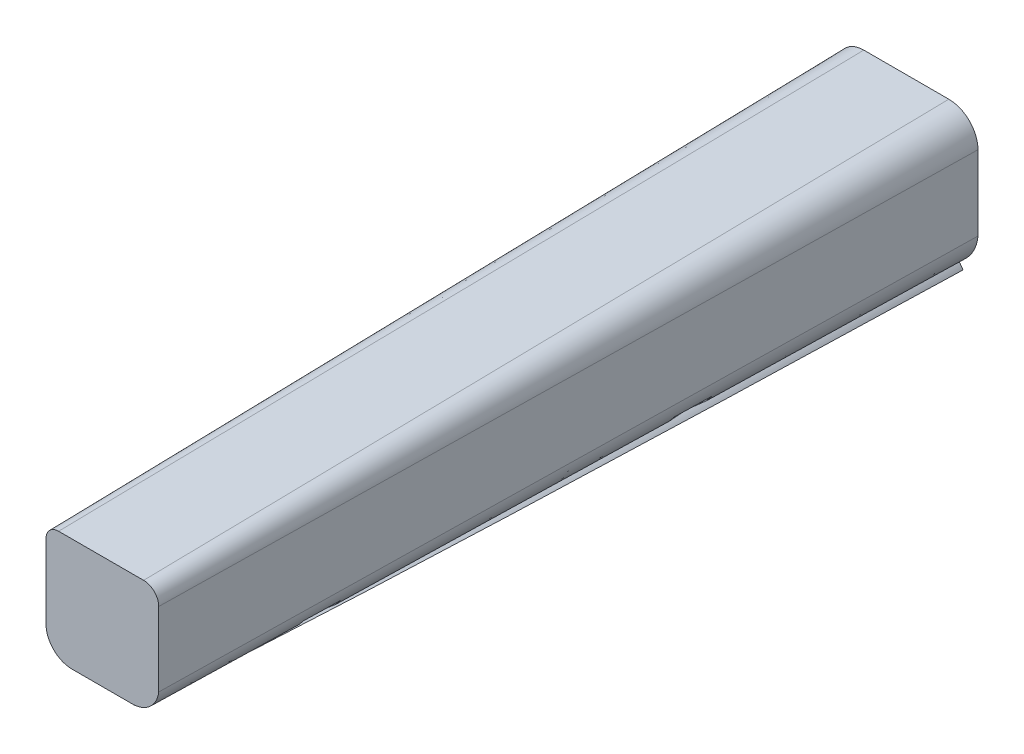
ISO-10303-21;
HEADER;
FILE_DESCRIPTION(('STEP AP214'),'2;1');
FILE_NAME('part.step','',(''),(''),'','','');
FILE_SCHEMA(('AUTOMOTIVE_DESIGN { 1 0 10303 214 1 1 1 1 }'));
ENDSEC;
DATA;
#1=APPLICATION_CONTEXT('core data for automotive mechanical design processes');
#2=APPLICATION_PROTOCOL_DEFINITION('international standard','automotive_design',2000,#1);
#3=PRODUCT_CONTEXT('',#1,'mechanical');
#4=PRODUCT('Part','Part','',(#3));
#5=PRODUCT_RELATED_PRODUCT_CATEGORY('part','',(#4));
#6=PRODUCT_DEFINITION_FORMATION('','',#4);
#7=PRODUCT_DEFINITION_CONTEXT('part definition',#1,'design');
#8=PRODUCT_DEFINITION('design','',#6,#7);
#9=PRODUCT_DEFINITION_SHAPE('','',#8);
#10=(LENGTH_UNIT() NAMED_UNIT(*) SI_UNIT(.MILLI.,.METRE.));
#11=(NAMED_UNIT(*) PLANE_ANGLE_UNIT() SI_UNIT($,.RADIAN.));
#12=(NAMED_UNIT(*) SI_UNIT($,.STERADIAN.) SOLID_ANGLE_UNIT());
#13=UNCERTAINTY_MEASURE_WITH_UNIT(LENGTH_MEASURE(1.E-05),#10,'distance_accuracy_value','');
#14=(GEOMETRIC_REPRESENTATION_CONTEXT(3) GLOBAL_UNCERTAINTY_ASSIGNED_CONTEXT((#13)) GLOBAL_UNIT_ASSIGNED_CONTEXT((#10,
#11,#12)) REPRESENTATION_CONTEXT('',''));
#15=CARTESIAN_POINT('',(0.,0.,0.));
#16=DIRECTION('',(0.,0.,1.));
#17=DIRECTION('',(1.,0.,0.));
#18=AXIS2_PLACEMENT_3D('',#15,#16,#17);
#19=CARTESIAN_POINT('',(-35.,35.,500.));
#20=DIRECTION('',(-0.999847695156391,0.,0.0174524064372835));
#21=DIRECTION('',(0.0174524064372835,0.,0.999847695156391));
#22=AXIS2_PLACEMENT_3D('',#19,#20,#21);
#23=PLANE('',#22);
#24=DIRECTION('',(-0.0174524064372835,0.,-0.999847695156391));
#25=VECTOR('',#24,1.);
#26=CARTESIAN_POINT('',(-35.,-18.8530894982488,500.));
#27=LINE('',#26,#25);
#28=CARTESIAN_POINT('',(-43.7275324641088,-18.8530894982488,0.));
#29=VERTEX_POINT('',#28);
#30=CARTESIAN_POINT('',(-35.,-18.8530894982488,500.));
#31=VERTEX_POINT('',#30);
#32=EDGE_CURVE('E145',#29,#31,#27,.F.);
#33=ORIENTED_EDGE('',*,*,#32,.T.);
#34=DIRECTION('',(0.,-1.,0.));
#35=VECTOR('',#34,1.);
#36=CARTESIAN_POINT('',(-35.,35.,500.));
#37=LINE('',#36,#35);
#38=CARTESIAN_POINT('',(-35.,27.1753626111588,500.));
#39=VERTEX_POINT('',#38);
#40=EDGE_CURVE('E120',#39,#31,#37,.T.);
#41=ORIENTED_EDGE('',*,*,#40,.F.);
#42=DIRECTION('',(-0.0174524064372835,0.,-0.999847695156391));
#43=VECTOR('',#42,1.);
#44=CARTESIAN_POINT('',(-35.,27.1753626111588,500.));
#45=LINE('',#44,#43);
#46=CARTESIAN_POINT('',(-43.7275324641088,27.1753626111588,0.));
#47=VERTEX_POINT('',#46);
#48=EDGE_CURVE('E104',#47,#39,#45,.F.);
#49=ORIENTED_EDGE('',*,*,#48,.F.);
#50=DIRECTION('',(0.,1.,0.));
#51=VECTOR('',#50,1.);
#52=CARTESIAN_POINT('',(-43.7275324641088,35.,0.));
#53=LINE('',#52,#51);
#54=EDGE_CURVE('E188',#47,#29,#53,.F.);
#55=ORIENTED_EDGE('',*,*,#54,.T.);
#56=EDGE_LOOP('',(#33,#41,#49,#55));
#57=FACE_BOUND('',#56,.T.);
#58=ADVANCED_FACE('F33',(#57),#23,.T.);
#59=CARTESIAN_POINT('',(35.,35.,500.));
#60=DIRECTION('',(0.999847695156391,0.,0.0174524064372835));
#61=DIRECTION('',(0.0174524064372835,0.,-0.999847695156391));
#62=AXIS2_PLACEMENT_3D('',#59,#60,#61);
#63=PLANE('',#62);
#64=DIRECTION('',(0.0174524064372835,0.,-0.999847695156391));
#65=VECTOR('',#64,1.);
#66=CARTESIAN_POINT('',(35.,25.617969734714,500.));
#67=LINE('',#66,#65);
#68=CARTESIAN_POINT('',(43.7275324641088,25.617969734714,0.));
#69=VERTEX_POINT('',#68);
#70=CARTESIAN_POINT('',(35.,25.617969734714,500.));
#71=VERTEX_POINT('',#70);
#72=EDGE_CURVE('E37',#69,#71,#67,.F.);
#73=ORIENTED_EDGE('',*,*,#72,.T.);
#74=DIRECTION('',(0.,1.,0.));
#75=VECTOR('',#74,1.);
#76=CARTESIAN_POINT('',(35.,35.,500.));
#77=LINE('',#76,#75);
#78=CARTESIAN_POINT('',(35.,-20.3554174348118,500.));
#79=VERTEX_POINT('',#78);
#80=EDGE_CURVE('E121',#79,#71,#77,.T.);
#81=ORIENTED_EDGE('',*,*,#80,.F.);
#82=CARTESIAN_POINT('',(43.7275324641088,-20.8024766961162,0.));
#83=CARTESIAN_POINT('',(43.4386732457331,-20.7890932360126,16.5487335374341));
#84=CARTESIAN_POINT('',(43.1498140288684,-20.775599016947,33.0974669883076));
#85=CARTESIAN_POINT('',(41.7055179524502,-20.707530118496,115.841133789759));
#86=CARTESIAN_POINT('',(40.5500811182559,-20.6511620298168,182.036065687517));
#87=CARTESIAN_POINT('',(37.9297628119664,-20.5177138251656,332.154000915221));
#88=CARTESIAN_POINT('',(36.4648813632845,-20.4391297232407,416.077002903819));
#89=CARTESIAN_POINT('',(35.,-20.3554174348118,500.));
#90=B_SPLINE_CURVE_WITH_KNOTS('',3,(#82,#83,#84,#85,#86,#87,#88,#89),.UNSPECIFIED.,.F.,.F.,(4,2,
2,4),(0.,49.6537793608185,248.268896898181,500.076364439177),.UNSPECIFIED.);
#91=CARTESIAN_POINT('',(43.7275324641088,-20.8024766961162,0.));
#92=VERTEX_POINT('',#91);
#93=EDGE_CURVE('E159',#92,#79,#90,.T.);
#94=ORIENTED_EDGE('',*,*,#93,.F.);
#95=DIRECTION('',(0.,-1.,0.));
#96=VECTOR('',#95,1.);
#97=CARTESIAN_POINT('',(43.7275324641088,35.,0.));
#98=LINE('',#97,#96);
#99=EDGE_CURVE('E132',#92,#69,#98,.F.);
#100=ORIENTED_EDGE('',*,*,#99,.T.);
#101=EDGE_LOOP('',(#73,#81,#94,#100));
#102=FACE_BOUND('',#101,.T.);
#103=ADVANCED_FACE('F170',(#102),#63,.T.);
#104=CARTESIAN_POINT('',(0.,0.,500.));
#105=DIRECTION('',(0.,0.,1.));
#106=DIRECTION('',(1.,0.,0.));
#107=AXIS2_PLACEMENT_3D('',#104,#105,#106);
#108=PLANE('',#107);
#109=CARTESIAN_POINT('',(19.586164264741,-51.8768525911298,500.));
#110=DIRECTION('',(0.,0.,1.));
#111=DIRECTION('',(1.,0.,0.));
#112=AXIS2_PLACEMENT_3D('',#109,#110,#111);
#113=CIRCLE('',#112,16.9070860603069);
#114=CARTESIAN_POINT('',(19.5748374743707,-34.9697703249774,500.));
#115=VERTEX_POINT('',#114);
#116=CARTESIAN_POINT('',(20.596810428292,-35.,500.));
#117=VERTEX_POINT('',#116);
#118=EDGE_CURVE('E52',#115,#117,#113,.F.);
#119=ORIENTED_EDGE('',*,*,#118,.F.);
#120=CARTESIAN_POINT('',(18.5755181011902,-18.4673538150547,500.));
#121=DIRECTION('',(0.,0.,1.));
#122=DIRECTION('',(1.,0.,0.));
#123=AXIS2_PLACEMENT_3D('',#120,#121,#122);
#124=CIRCLE('',#123,16.5326461849452);
#125=EDGE_CURVE('E205',#115,#79,#124,.T.);
#126=ORIENTED_EDGE('',*,*,#125,.T.);
#127=ORIENTED_EDGE('',*,*,#80,.T.);
#128=CARTESIAN_POINT('',(25.617969734714,25.617969734714,500.));
#129=DIRECTION('',(0.,0.,-1.));
#130=DIRECTION('',(1.,0.,0.));
#131=AXIS2_PLACEMENT_3D('',#128,#129,#130);
#132=CIRCLE('',#131,9.38203026528603);
#133=CARTESIAN_POINT('',(25.617969734714,35.,500.));
#134=VERTEX_POINT('',#133);
#135=EDGE_CURVE('E116',#134,#71,#132,.T.);
#136=ORIENTED_EDGE('',*,*,#135,.F.);
#137=DIRECTION('',(-1.,0.,0.));
#138=VECTOR('',#137,1.);
#139=CARTESIAN_POINT('',(-35.,35.,500.));
#140=LINE('',#139,#138);
#141=CARTESIAN_POINT('',(-27.1753626111588,35.,500.));
#142=VERTEX_POINT('',#141);
#143=EDGE_CURVE('E110',#134,#142,#140,.T.);
#144=ORIENTED_EDGE('',*,*,#143,.T.);
#145=CARTESIAN_POINT('',(-27.1753626111588,27.1753626111588,500.));
#146=DIRECTION('',(0.,0.,-1.));
#147=DIRECTION('',(1.,0.,0.));
#148=AXIS2_PLACEMENT_3D('',#145,#146,#147);
#149=CIRCLE('',#148,7.82463738884118);
#150=EDGE_CURVE('E113',#39,#142,#149,.T.);
#151=ORIENTED_EDGE('',*,*,#150,.F.);
#152=ORIENTED_EDGE('',*,*,#40,.T.);
#153=CARTESIAN_POINT('',(-18.8530894982488,-18.8530894982488,500.));
#154=DIRECTION('',(0.,0.,-1.));
#155=DIRECTION('',(1.,0.,0.));
#156=AXIS2_PLACEMENT_3D('',#153,#154,#155);
#157=CIRCLE('',#156,16.1469105017512);
#158=CARTESIAN_POINT('',(-18.8530894982488,-35.,500.));
#159=VERTEX_POINT('',#158);
#160=EDGE_CURVE('E183',#159,#31,#157,.T.);
#161=ORIENTED_EDGE('',*,*,#160,.F.);
#162=DIRECTION('',(1.,0.,0.));
#163=VECTOR('',#162,1.);
#164=CARTESIAN_POINT('',(-35.,-35.,500.));
#165=LINE('',#164,#163);
#166=EDGE_CURVE('E43',#159,#117,#165,.T.);
#167=ORIENTED_EDGE('',*,*,#166,.T.);
#168=EDGE_LOOP('',(#119,#126,#127,#136,#144,#151,#152,#161,#167));
#169=FACE_BOUND('',#168,.T.);
#170=ADVANCED_FACE('F111',(#169),#108,.T.);
#171=CARTESIAN_POINT('',(0.,0.,0.));
#172=DIRECTION('',(0.,0.,1.));
#173=DIRECTION('',(1.,0.,0.));
#174=AXIS2_PLACEMENT_3D('',#171,#172,#173);
#175=PLANE('',#174);
#176=CARTESIAN_POINT('',(18.5755181011902,-18.4673538150547,0.));
#177=DIRECTION('',(0.,0.,1.));
#178=DIRECTION('',(1.,0.,0.));
#179=AXIS2_PLACEMENT_3D('',#176,#177,#178);
#180=CIRCLE('',#179,25.260178649054);
#181=CARTESIAN_POINT('',(31.6802371063288,-40.062329276455,0.));
#182=VERTEX_POINT('',#181);
#183=EDGE_CURVE('E150',#182,#92,#180,.T.);
#184=ORIENTED_EDGE('',*,*,#183,.F.);
#185=CARTESIAN_POINT('',(19.586164264741,-51.8768525911298,0.));
#186=DIRECTION('',(0.,0.,1.));
#187=DIRECTION('',(1.,0.,0.));
#188=AXIS2_PLACEMENT_3D('',#185,#186,#187);
#189=CIRCLE('',#188,16.9070860603069);
#190=CARTESIAN_POINT('',(34.3996088512629,-43.7275324641088,0.));
#191=VERTEX_POINT('',#190);
#192=EDGE_CURVE('E152',#182,#191,#189,.F.);
#193=ORIENTED_EDGE('',*,*,#192,.T.);
#194=DIRECTION('',(-1.,0.,0.));
#195=VECTOR('',#194,1.);
#196=CARTESIAN_POINT('',(-35.,-43.7275324641088,0.));
#197=LINE('',#196,#195);
#198=CARTESIAN_POINT('',(-18.8530894982488,-43.7275324641088,0.));
#199=VERTEX_POINT('',#198);
#200=EDGE_CURVE('E185',#199,#191,#197,.F.);
#201=ORIENTED_EDGE('',*,*,#200,.F.);
#202=CARTESIAN_POINT('',(-18.8530894982488,-18.8530894982488,0.));
#203=DIRECTION('',(0.,0.,1.));
#204=DIRECTION('',(1.,0.,0.));
#205=AXIS2_PLACEMENT_3D('',#202,#203,#204);
#206=CIRCLE('',#205,24.87444296586);
#207=EDGE_CURVE('E189',#199,#29,#206,.F.);
#208=ORIENTED_EDGE('',*,*,#207,.T.);
#209=ORIENTED_EDGE('',*,*,#54,.F.);
#210=CARTESIAN_POINT('',(-27.1753626111588,27.1753626111588,0.));
#211=DIRECTION('',(0.,0.,1.));
#212=DIRECTION('',(1.,0.,0.));
#213=AXIS2_PLACEMENT_3D('',#210,#211,#212);
#214=CIRCLE('',#213,16.55216985295);
#215=CARTESIAN_POINT('',(-27.1753626111588,43.7275324641088,0.));
#216=VERTEX_POINT('',#215);
#217=EDGE_CURVE('E127',#47,#216,#214,.F.);
#218=ORIENTED_EDGE('',*,*,#217,.T.);
#219=DIRECTION('',(1.,0.,0.));
#220=VECTOR('',#219,1.);
#221=CARTESIAN_POINT('',(-35.,43.7275324641088,0.));
#222=LINE('',#221,#220);
#223=CARTESIAN_POINT('',(25.617969734714,43.7275324641088,0.));
#224=VERTEX_POINT('',#223);
#225=EDGE_CURVE('E131',#224,#216,#222,.F.);
#226=ORIENTED_EDGE('',*,*,#225,.F.);
#227=CARTESIAN_POINT('',(25.617969734714,25.617969734714,0.));
#228=DIRECTION('',(0.,0.,1.));
#229=DIRECTION('',(1.,0.,0.));
#230=AXIS2_PLACEMENT_3D('',#227,#228,#229);
#231=CIRCLE('',#230,18.1095627293948);
#232=EDGE_CURVE('E138',#224,#69,#231,.F.);
#233=ORIENTED_EDGE('',*,*,#232,.T.);
#234=ORIENTED_EDGE('',*,*,#99,.F.);
#235=EDGE_LOOP('',(#184,#193,#201,#208,#209,#218,#226,#233,#234));
#236=FACE_BOUND('',#235,.T.);
#237=ADVANCED_FACE('F196',(#236),#175,.F.);
#238=CARTESIAN_POINT('',(-35.,35.,500.));
#239=DIRECTION('',(0.,0.999847695156391,0.0174524064372835));
#240=DIRECTION('',(0.,-0.0174524064372835,0.999847695156391));
#241=AXIS2_PLACEMENT_3D('',#238,#239,#240);
#242=PLANE('',#241);
#243=ORIENTED_EDGE('',*,*,#143,.F.);
#244=DIRECTION('',(0.,0.0174524064372836,-0.999847695156391));
#245=VECTOR('',#244,1.);
#246=CARTESIAN_POINT('',(25.617969734714,35.,500.));
#247=LINE('',#246,#245);
#248=EDGE_CURVE('E137',#224,#134,#247,.F.);
#249=ORIENTED_EDGE('',*,*,#248,.F.);
#250=ORIENTED_EDGE('',*,*,#225,.T.);
#251=DIRECTION('',(0.,0.0174524064372835,-0.999847695156391));
#252=VECTOR('',#251,1.);
#253=CARTESIAN_POINT('',(-27.1753626111588,35.,500.));
#254=LINE('',#253,#252);
#255=EDGE_CURVE('E125',#216,#142,#254,.F.);
#256=ORIENTED_EDGE('',*,*,#255,.T.);
#257=EDGE_LOOP('',(#243,#249,#250,#256));
#258=FACE_BOUND('',#257,.T.);
#259=ADVANCED_FACE('F129',(#258),#242,.T.);
#260=CARTESIAN_POINT('',(-35.,-35.,500.));
#261=DIRECTION('',(0.,-0.999847695156391,0.0174524064372835));
#262=DIRECTION('',(0.,-0.0174524064372835,-0.999847695156391));
#263=AXIS2_PLACEMENT_3D('',#260,#261,#262);
#264=PLANE('',#263);
#265=ORIENTED_EDGE('',*,*,#200,.T.);
#266=CARTESIAN_POINT('',(19.586164264741,-51.8768525911298,-466.874237393806));
#267=DIRECTION('',(0.,-0.999847695156391,0.0174524064372835));
#268=DIRECTION('',(0.,0.0174524064372835,0.999847695156391));
#269=AXIS2_PLACEMENT_3D('',#266,#267,#268);
#270=ELLIPSE('',#269,968.753857587704,16.9070860603069);
#271=EDGE_CURVE('E11',#191,#117,#270,.T.);
#272=ORIENTED_EDGE('',*,*,#271,.T.);
#273=ORIENTED_EDGE('',*,*,#166,.F.);
#274=DIRECTION('',(0.,-0.0174524064372835,-0.999847695156391));
#275=VECTOR('',#274,1.);
#276=CARTESIAN_POINT('',(-18.8530894982488,-35.,500.));
#277=LINE('',#276,#275);
#278=EDGE_CURVE('E192',#199,#159,#277,.F.);
#279=ORIENTED_EDGE('',*,*,#278,.F.);
#280=EDGE_LOOP('',(#265,#272,#273,#279));
#281=FACE_BOUND('',#280,.T.);
#282=ADVANCED_FACE('F173',(#281),#264,.T.);
#283=CARTESIAN_POINT('',(-27.1753626111588,27.1753626111588,500.));
#284=DIRECTION('',(0.,0.,-1.));
#285=DIRECTION('',(1.,0.,0.));
#286=AXIS2_PLACEMENT_3D('',#283,#284,#285);
#287=CONICAL_SURFACE('',#286,7.82463738884118,0.0174532925199433);
#288=ORIENTED_EDGE('',*,*,#150,.T.);
#289=ORIENTED_EDGE('',*,*,#255,.F.);
#290=ORIENTED_EDGE('',*,*,#217,.F.);
#291=ORIENTED_EDGE('',*,*,#48,.T.);
#292=EDGE_LOOP('',(#288,#289,#290,#291));
#293=FACE_BOUND('',#292,.T.);
#294=ADVANCED_FACE('F124',(#293),#287,.T.);
#295=CARTESIAN_POINT('',(25.617969734714,25.617969734714,500.));
#296=DIRECTION('',(0.,0.,-1.));
#297=DIRECTION('',(1.,0.,0.));
#298=AXIS2_PLACEMENT_3D('',#295,#296,#297);
#299=CONICAL_SURFACE('',#298,9.38203026528603,0.0174532925199433);
#300=ORIENTED_EDGE('',*,*,#135,.T.);
#301=ORIENTED_EDGE('',*,*,#72,.F.);
#302=ORIENTED_EDGE('',*,*,#232,.F.);
#303=ORIENTED_EDGE('',*,*,#248,.T.);
#304=EDGE_LOOP('',(#300,#301,#302,#303));
#305=FACE_BOUND('',#304,.T.);
#306=ADVANCED_FACE('F35',(#305),#299,.T.);
#307=CARTESIAN_POINT('',(-18.8530894982488,-18.8530894982488,500.));
#308=DIRECTION('',(0.,0.,-1.));
#309=DIRECTION('',(1.,0.,0.));
#310=AXIS2_PLACEMENT_3D('',#307,#308,#309);
#311=CONICAL_SURFACE('',#310,16.1469105017512,0.0174532925199433);
#312=ORIENTED_EDGE('',*,*,#160,.T.);
#313=ORIENTED_EDGE('',*,*,#32,.F.);
#314=ORIENTED_EDGE('',*,*,#207,.F.);
#315=ORIENTED_EDGE('',*,*,#278,.T.);
#316=EDGE_LOOP('',(#312,#313,#314,#315));
#317=FACE_BOUND('',#316,.T.);
#318=ADVANCED_FACE('F169',(#317),#311,.T.);
#319=CARTESIAN_POINT('',(18.5755181011902,-18.4673538150547,500.));
#320=DIRECTION('',(0.,0.,-1.));
#321=DIRECTION('',(1.,0.,0.));
#322=AXIS2_PLACEMENT_3D('',#319,#320,#321);
#323=CONICAL_SURFACE('',#322,16.5326461849452,0.0174532925199433);
#324=ORIENTED_EDGE('',*,*,#93,.T.);
#325=ORIENTED_EDGE('',*,*,#125,.F.);
#326=CARTESIAN_POINT('',(31.6802371063288,-40.062329276455,0.));
#327=CARTESIAN_POINT('',(31.6449568613436,-40.0262142992165,2.81739227715364));
#328=CARTESIAN_POINT('',(31.609472687378,-39.9902140874253,5.6347834713371));
#329=CARTESIAN_POINT('',(31.5380916994411,-39.918443353331,11.269562593139));
#330=CARTESIAN_POINT('',(31.5021948856111,-39.8826728309494,14.0869505207583));
#331=CARTESIAN_POINT('',(31.4299837151973,-39.8113615141896,19.7217314721312));
#332=CARTESIAN_POINT('',(31.3936693574972,-39.775820720426,22.5391244958784));
#333=CARTESIAN_POINT('',(31.3206178098007,-39.7049691094247,28.1739088977719));
#334=CARTESIAN_POINT('',(31.2838806196613,-39.6696582922648,30.9913002759174));
#335=CARTESIAN_POINT('',(31.0991243072214,-39.4936790519186,45.0782916031839));
#336=CARTESIAN_POINT('',(30.9478956952659,-39.3547367221595,56.3478712971815));
#337=CARTESIAN_POINT('',(30.6381739474181,-39.0805473894087,78.8869552044397));
#338=CARTESIAN_POINT('',(30.4796808248663,-38.9453003796316,90.1564594178009));
#339=CARTESIAN_POINT('',(30.2360782867449,-38.7452143606959,107.060616843235));
#340=CARTESIAN_POINT('',(30.1539006541126,-38.6789833747248,112.695295947555));
#341=CARTESIAN_POINT('',(29.9875049430075,-38.5474520054838,123.964633025537));
#342=CARTESIAN_POINT('',(29.9032868652192,-38.4821516219018,129.599290999205));
#343=CARTESIAN_POINT('',(29.7327149035544,-38.3524838558146,140.868625635069));
#344=CARTESIAN_POINT('',(29.6463610044342,-38.2881164799735,146.50330229711));
#345=CARTESIAN_POINT('',(29.4714045867287,-38.1603185768873,157.772638149505));
#346=CARTESIAN_POINT('',(29.3828020653836,-38.0968880507922,163.407297339829));
#347=CARTESIAN_POINT('',(29.0732166456594,-37.87979625734,182.835977489485));
#348=CARTESIAN_POINT('',(28.8463295100409,-37.7284829030278,196.629931781393));
#349=CARTESIAN_POINT('',(28.4935527291187,-37.5057959016297,217.320652021915));
#350=CARTESIAN_POINT('',(28.3738865244386,-37.4322809673544,224.217501552701));
#351=CARTESIAN_POINT('',(28.1299888938677,-37.2866912447387,238.011137142395));
#352=CARTESIAN_POINT('',(28.0057574667622,-37.2146164567816,244.907923201286));
#353=CARTESIAN_POINT('',(27.7522427092117,-37.0719250981904,258.701121159175));
#354=CARTESIAN_POINT('',(27.6229595960847,-37.0013084650274,265.597533061517));
#355=CARTESIAN_POINT('',(27.3587164656507,-36.8615491747666,279.3902565091));
#356=CARTESIAN_POINT('',(27.2237564538873,-36.7924065162296,286.286568054433));
#357=CARTESIAN_POINT('',(26.9473695039218,-36.6556174839895,300.079236103468));
#358=CARTESIAN_POINT('',(26.8059424163476,-36.5879711449011,306.975592604526));
#359=CARTESIAN_POINT('',(26.5156036847806,-36.4542072385681,320.768187759328));
#360=CARTESIAN_POINT('',(26.3666920143212,-36.3880896767307,327.664426412568));
#361=CARTESIAN_POINT('',(26.0599959435826,-36.2574141375796,341.457880490945));
#362=CARTESIAN_POINT('',(25.9022100574358,-36.1928564240439,348.355095885623));
#363=CARTESIAN_POINT('',(25.575931141871,-36.0653695471284,362.149205018642));
#364=CARTESIAN_POINT('',(25.4074382448188,-36.0024403636294,369.046098759905));
#365=CARTESIAN_POINT('',(25.1446229527132,-35.9093326812259,379.390896140961));
#366=CARTESIAN_POINT('',(25.0553426099934,-35.8785124410162,382.838922286621));
#367=CARTESIAN_POINT('',(24.8729453799554,-35.8173142656931,389.734871841091));
#368=CARTESIAN_POINT('',(24.7798284986939,-35.7869363298815,393.182795250055));
#369=CARTESIAN_POINT('',(24.5891792352237,-35.7266390541789,400.078663776118));
#370=CARTESIAN_POINT('',(24.4916466746567,-35.6967197328777,403.526608888459));
#371=CARTESIAN_POINT('',(24.291423360244,-35.6373635527807,410.422373632029));
#372=CARTESIAN_POINT('',(24.188732576903,-35.607926696745,413.870193262427));
#373=CARTESIAN_POINT('',(23.9771813835363,-35.5495569664111,420.766669422352));
#374=CARTESIAN_POINT('',(23.8683191570781,-35.520624243804,424.215325897671));
#375=CARTESIAN_POINT('',(23.6431086509956,-35.4633134778199,431.112330976494));
#376=CARTESIAN_POINT('',(23.5267605206491,-35.4349354233969,434.560679584766));
#377=CARTESIAN_POINT('',(23.2846998599296,-35.3787955501454,441.456544235996));
#378=CARTESIAN_POINT('',(23.1589887213852,-35.3510336405191,444.904060326574));
#379=CARTESIAN_POINT('',(22.9611742162566,-35.3099165384769,450.07509637072));
#380=CARTESIAN_POINT('',(22.8936924140918,-35.296298032513,451.798791166019));
#381=CARTESIAN_POINT('',(22.7551061510237,-35.2692530570552,455.246051564651));
#382=CARTESIAN_POINT('',(22.6840016598996,-35.2558265891645,456.969617166787));
#383=CARTESIAN_POINT('',(22.5374532957518,-35.2291800058181,460.41743404451));
#384=CARTESIAN_POINT('',(22.4620072594386,-35.215959997481,462.141685229264));
#385=CARTESIAN_POINT('',(22.3058793135476,-35.1897622415224,465.589903696158));
#386=CARTESIAN_POINT('',(22.225197555494,-35.176784486904,467.313870985067));
#387=CARTESIAN_POINT('',(22.0572899724138,-35.151114628097,470.761088896501));
#388=CARTESIAN_POINT('',(21.9700656716709,-35.1384224582631,472.484339592481));
#389=CARTESIAN_POINT('',(21.787098057498,-35.1133794585813,475.930569224774));
#390=CARTESIAN_POINT('',(21.6913538992027,-35.1010286627451,477.653548117125));
#391=CARTESIAN_POINT('',(21.5388505106685,-35.0828306827092,480.238188318314));
#392=CARTESIAN_POINT('',(21.4865120960545,-35.0768170473847,481.100109170559));
#393=CARTESIAN_POINT('',(21.3782311483512,-35.0649213704198,482.823695459046));
#394=CARTESIAN_POINT('',(21.3222887443425,-35.0590393240767,483.685360903326));
#395=CARTESIAN_POINT('',(21.2059478847908,-35.047435407054,485.408113990606));
#396=CARTESIAN_POINT('',(21.1455508775255,-35.0417134851422,486.269201730352));
#397=CARTESIAN_POINT('',(21.018965616246,-35.0304678689246,487.991061485834));
#398=CARTESIAN_POINT('',(20.9527766490359,-35.0249441991491,488.851833449545));
#399=CARTESIAN_POINT('',(20.8125091486502,-35.0141527407019,490.573725465071));
#400=CARTESIAN_POINT('',(20.7384218134237,-35.008885247236,491.434844817004));
#401=CARTESIAN_POINT('',(20.6185820070597,-35.0012711545422,492.72554712214));
#402=CARTESIAN_POINT('',(20.5771929808635,-34.9987814454348,493.155533521285));
#403=CARTESIAN_POINT('',(20.4906741535151,-34.9939230170159,494.01518709409));
#404=CARTESIAN_POINT('',(20.4455438976628,-34.9915543124678,494.444854222526));
#405=CARTESIAN_POINT('',(20.3502503113252,-34.9869736623445,495.304250429773));
#406=CARTESIAN_POINT('',(20.3000799421712,-34.9847619435669,495.733978734252));
#407=CARTESIAN_POINT('',(20.1927317854741,-34.9805641669249,496.592439061194));
#408=CARTESIAN_POINT('',(20.1355563293899,-34.9785780344017,497.021171367003));
#409=CARTESIAN_POINT('',(20.041344321137,-34.9758658313764,497.663385768398));
#410=CARTESIAN_POINT('',(20.0085034509835,-34.975005700288,497.877475435468));
#411=CARTESIAN_POINT('',(19.9388966576008,-34.9734114302085,498.30496057945));
#412=CARTESIAN_POINT('',(19.9021316538256,-34.9726772618082,498.518356206959));
#413=CARTESIAN_POINT('',(19.8232273567479,-34.9713785015197,498.944481581798));
#414=CARTESIAN_POINT('',(19.7810815982225,-34.970814116418,499.157210207365));
#415=CARTESIAN_POINT('',(19.6867052936937,-34.9700097928791,499.58056678413));
#416=CARTESIAN_POINT('',(19.6344663043827,-34.9697701274347,499.791192820214));
#417=CARTESIAN_POINT('',(19.5748374743732,-34.9697703249773,500.));
#418=B_SPLINE_CURVE_WITH_KNOTS('',3,(#326,#327,#328,#329,#330,#331,#332,#333,#334,#335,#336,
#337,#338,#339,#340,#341,#342,#343,#344,#345,#346,#347,#348,#349,#350,#351,#352,#353,#354,#355,
#356,#357,#358,#359,#360,#361,#362,#363,#364,#365,#366,#367,#368,#369,#370,#371,#372,#373,#374,
#375,#376,#377,#378,#379,#380,#381,#382,#383,#384,#385,#386,#387,#388,#389,#390,#391,#392,#393,
#394,#395,#396,#397,#398,#399,#400,#401,#402,#403,#404,#405,#406,#407,#408,#409,#410,#411,#412,
#413,#414,#415,#416,#417),.UNSPECIFIED.,.F.,.F.,(4,2,2,2,2,2,2,2,2,2,2,2,2,2,2,2,2,2,2,2,2,2,2,
2,2,2,2,2,2,2,2,2,2,2,2,2,2,2,2,2,2,2,2,2,2,4),(0.,8.45353381075282,16.9070647277863,
25.3606182519477,33.8141746374296,67.6285237642072,101.442810797314,118.349812958089,
135.256809446982,152.163926637199,169.071064579436,210.461002398566,231.155839180164,
251.850681468544,272.544634465637,293.238567254716,313.932978259498,334.627462448135,
355.325422024088,376.023125770414,386.371082619025,396.719023132037,407.067381992813,
417.415800033363,427.767279884942,438.118553379582,448.468291197398,453.643495182222,
458.818742346286,463.996590926354,469.174289723844,474.35078594389,479.527796060535,
482.118378457599,484.708868121864,487.298519249303,489.888489704752,492.481377242939,
493.777308680216,495.073397853468,496.371322902974,497.668817139809,498.318571960539,
498.968174871636,499.618565788495,500.269503152205),.UNSPECIFIED.);
#419=EDGE_CURVE('E86',#182,#115,#418,.T.);
#420=ORIENTED_EDGE('',*,*,#419,.F.);
#421=ORIENTED_EDGE('',*,*,#183,.T.);
#422=EDGE_LOOP('',(#324,#325,#420,#421));
#423=FACE_BOUND('',#422,.T.);
#424=ADVANCED_FACE('F164',(#423),#323,.T.);
#425=CARTESIAN_POINT('',(19.586164264741,-51.8768525911298,0.));
#426=DIRECTION('',(0.,0.,1.));
#427=DIRECTION('',(1.,0.,0.));
#428=AXIS2_PLACEMENT_3D('',#425,#426,#427);
#429=CYLINDRICAL_SURFACE('',#428,16.9070860603069);
#430=ORIENTED_EDGE('',*,*,#192,.F.);
#431=ORIENTED_EDGE('',*,*,#419,.T.);
#432=ORIENTED_EDGE('',*,*,#118,.T.);
#433=ORIENTED_EDGE('',*,*,#271,.F.);
#434=EDGE_LOOP('',(#430,#431,#432,#433));
#435=FACE_BOUND('',#434,.T.);
#436=ADVANCED_FACE('F161',(#435),#429,.T.);
#437=CLOSED_SHELL('',(#58,#103,#170,#237,#259,#282,#294,#306,#318,#424,#436));
#438=MANIFOLD_SOLID_BREP('B2',#437);
#439=ADVANCED_BREP_SHAPE_REPRESENTATION('',(#18,#438),#14);
#440=SHAPE_DEFINITION_REPRESENTATION(#9,#439);
ENDSEC;
END-ISO-10303-21;
